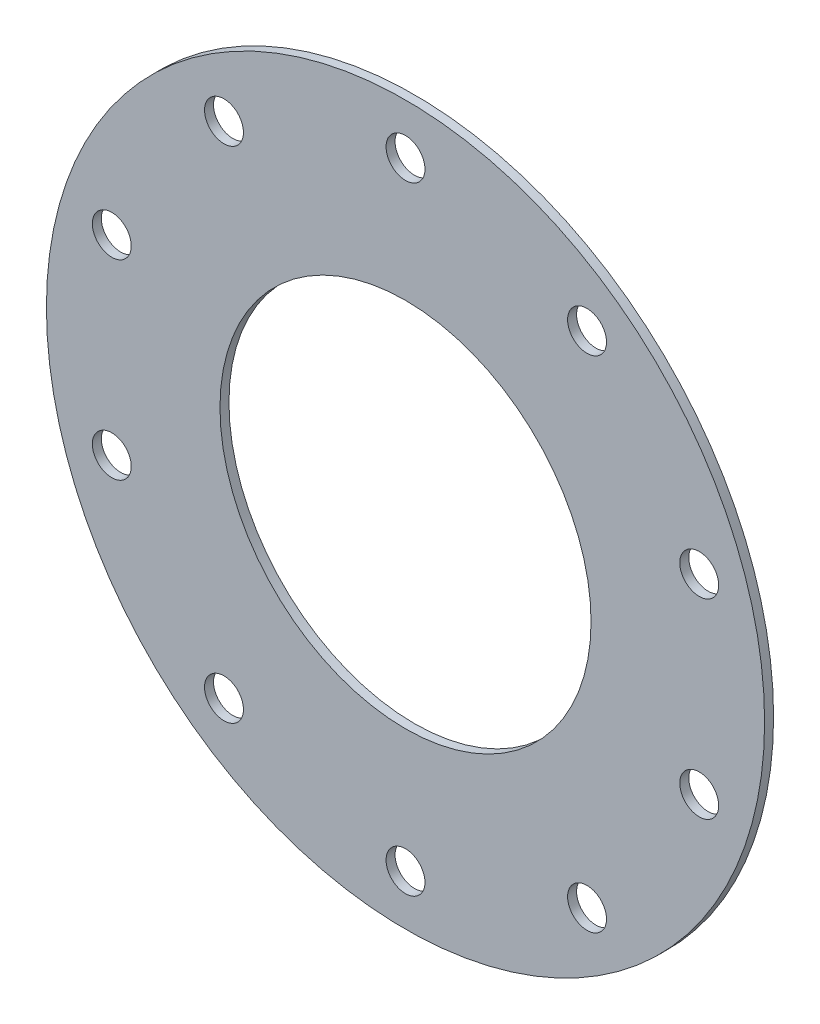
ISO-10303-21;
HEADER;
FILE_DESCRIPTION(('STEP AP214'),'2;1');
FILE_NAME('part.step','',(''),(''),'','','');
FILE_SCHEMA(('AUTOMOTIVE_DESIGN { 1 0 10303 214 1 1 1 1 }'));
ENDSEC;
DATA;
#1=APPLICATION_CONTEXT('core data for automotive mechanical design processes');
#2=APPLICATION_PROTOCOL_DEFINITION('international standard','automotive_design',2000,#1);
#3=PRODUCT_CONTEXT('',#1,'mechanical');
#4=PRODUCT('Part','Part','',(#3));
#5=PRODUCT_RELATED_PRODUCT_CATEGORY('part','',(#4));
#6=PRODUCT_DEFINITION_FORMATION('','',#4);
#7=PRODUCT_DEFINITION_CONTEXT('part definition',#1,'design');
#8=PRODUCT_DEFINITION('design','',#6,#7);
#9=PRODUCT_DEFINITION_SHAPE('','',#8);
#10=(LENGTH_UNIT() NAMED_UNIT(*) SI_UNIT(.MILLI.,.METRE.));
#11=(NAMED_UNIT(*) PLANE_ANGLE_UNIT() SI_UNIT($,.RADIAN.));
#12=(NAMED_UNIT(*) SI_UNIT($,.STERADIAN.) SOLID_ANGLE_UNIT());
#13=UNCERTAINTY_MEASURE_WITH_UNIT(LENGTH_MEASURE(1.E-05),#10,'distance_accuracy_value','');
#14=(GEOMETRIC_REPRESENTATION_CONTEXT(3) GLOBAL_UNCERTAINTY_ASSIGNED_CONTEXT((#13)) GLOBAL_UNIT_ASSIGNED_CONTEXT((#10,
#11,#12)) REPRESENTATION_CONTEXT('',''));
#15=CARTESIAN_POINT('',(0.,0.,0.));
#16=DIRECTION('',(0.,0.,1.));
#17=DIRECTION('',(1.,0.,0.));
#18=AXIS2_PLACEMENT_3D('',#15,#16,#17);
#19=CARTESIAN_POINT('',(0.,0.,1.5));
#20=DIRECTION('',(0.,0.,1.));
#21=DIRECTION('',(1.,0.,0.));
#22=AXIS2_PLACEMENT_3D('',#19,#20,#21);
#23=PLANE('',#22);
#24=CARTESIAN_POINT('',(-49.0745162408275,15.9452769097439,1.5));
#25=DIRECTION('',(0.,0.,1.));
#26=DIRECTION('',(1.,0.,0.));
#27=AXIS2_PLACEMENT_3D('',#24,#25,#26);
#28=CIRCLE('',#27,3.25000000000388);
#29=CARTESIAN_POINT('',(-45.8245162408236,15.9452769097439,1.5));
#30=VERTEX_POINT('',#29);
#31=EDGE_CURVE('E96',#30,#30,#28,.T.);
#32=ORIENTED_EDGE('',*,*,#31,.F.);
#33=EDGE_LOOP('',(#32));
#34=FACE_BOUND('',#33,.T.);
#35=CARTESIAN_POINT('',(-30.3297190182852,-41.7452769097494,1.5));
#36=DIRECTION('',(0.,0.,1.));
#37=DIRECTION('',(1.,0.,0.));
#38=AXIS2_PLACEMENT_3D('',#35,#36,#37);
#39=CIRCLE('',#38,3.25000000000091);
#40=CARTESIAN_POINT('',(-27.0797190182843,-41.7452769097494,1.5));
#41=VERTEX_POINT('',#40);
#42=EDGE_CURVE('E84',#41,#41,#39,.T.);
#43=ORIENTED_EDGE('',*,*,#42,.F.);
#44=EDGE_LOOP('',(#43));
#45=FACE_BOUND('',#44,.T.);
#46=CARTESIAN_POINT('',(30.329719018298,-41.7452769097452,1.5));
#47=DIRECTION('',(0.,0.,1.));
#48=DIRECTION('',(1.,0.,0.));
#49=AXIS2_PLACEMENT_3D('',#46,#47,#48);
#50=CIRCLE('',#49,3.24999999999605);
#51=CARTESIAN_POINT('',(33.579719018294,-41.7452769097452,1.5));
#52=VERTEX_POINT('',#51);
#53=EDGE_CURVE('E72',#52,#52,#50,.T.);
#54=ORIENTED_EDGE('',*,*,#53,.F.);
#55=EDGE_LOOP('',(#54));
#56=FACE_BOUND('',#55,.T.);
#57=CARTESIAN_POINT('',(49.0745162408324,15.9452769097506,1.5));
#58=DIRECTION('',(0.,0.,1.));
#59=DIRECTION('',(1.,0.,0.));
#60=AXIS2_PLACEMENT_3D('',#57,#58,#59);
#61=CIRCLE('',#60,3.24999999999749);
#62=CARTESIAN_POINT('',(52.3245162408298,15.9452769097506,1.5));
#63=VERTEX_POINT('',#62);
#64=EDGE_CURVE('E60',#63,#63,#61,.T.);
#65=ORIENTED_EDGE('',*,*,#64,.F.);
#66=EDGE_LOOP('',(#65));
#67=FACE_BOUND('',#66,.T.);
#68=CARTESIAN_POINT('',(0.,51.6,1.5));
#69=DIRECTION('',(0.,0.,1.));
#70=DIRECTION('',(1.,0.,0.));
#71=AXIS2_PLACEMENT_3D('',#68,#69,#70);
#72=CIRCLE('',#71,3.25);
#73=CARTESIAN_POINT('',(3.25,51.6,1.5));
#74=VERTEX_POINT('',#73);
#75=EDGE_CURVE('E48',#74,#74,#72,.T.);
#76=ORIENTED_EDGE('',*,*,#75,.F.);
#77=EDGE_LOOP('',(#76));
#78=FACE_BOUND('',#77,.T.);
#79=CARTESIAN_POINT('',(0.,0.,1.5));
#80=DIRECTION('',(0.,0.,1.));
#81=DIRECTION('',(1.,0.,0.));
#82=AXIS2_PLACEMENT_3D('',#79,#80,#81);
#83=CIRCLE('',#82,60.);
#84=CARTESIAN_POINT('',(60.,0.,1.5));
#85=VERTEX_POINT('',#84);
#86=EDGE_CURVE('E10',#85,#85,#83,.T.);
#87=ORIENTED_EDGE('',*,*,#86,.T.);
#88=EDGE_LOOP('',(#87));
#89=FACE_BOUND('',#88,.T.);
#90=CARTESIAN_POINT('',(0.,0.,1.5));
#91=DIRECTION('',(0.,0.,1.));
#92=DIRECTION('',(1.,0.,0.));
#93=AXIS2_PLACEMENT_3D('',#90,#91,#92);
#94=CIRCLE('',#93,31.);
#95=CARTESIAN_POINT('',(31.,0.,1.5));
#96=VERTEX_POINT('',#95);
#97=EDGE_CURVE('E43',#96,#96,#94,.T.);
#98=ORIENTED_EDGE('',*,*,#97,.F.);
#99=EDGE_LOOP('',(#98));
#100=FACE_BOUND('',#99,.T.);
#101=CARTESIAN_POINT('',(30.3297190182923,41.7452769097494,1.5));
#102=DIRECTION('',(0.,0.,1.));
#103=DIRECTION('',(1.,0.,0.));
#104=AXIS2_PLACEMENT_3D('',#101,#102,#103);
#105=CIRCLE('',#104,3.2499999999995);
#106=CARTESIAN_POINT('',(33.5797190182918,41.7452769097494,1.5));
#107=VERTEX_POINT('',#106);
#108=EDGE_CURVE('E54',#107,#107,#105,.T.);
#109=ORIENTED_EDGE('',*,*,#108,.F.);
#110=EDGE_LOOP('',(#109));
#111=FACE_BOUND('',#110,.T.);
#112=CARTESIAN_POINT('',(49.0745162408345,-15.9452769097439,1.5));
#113=DIRECTION('',(0.,0.,1.));
#114=DIRECTION('',(1.,0.,0.));
#115=AXIS2_PLACEMENT_3D('',#112,#113,#114);
#116=CIRCLE('',#115,3.24999999999594);
#117=CARTESIAN_POINT('',(52.3245162408305,-15.9452769097439,1.5));
#118=VERTEX_POINT('',#117);
#119=EDGE_CURVE('E66',#118,#118,#116,.T.);
#120=ORIENTED_EDGE('',*,*,#119,.F.);
#121=EDGE_LOOP('',(#120));
#122=FACE_BOUND('',#121,.T.);
#123=CARTESIAN_POINT('',(7.04518263933787E-12,-51.6,1.5));
#124=DIRECTION('',(0.,0.,1.));
#125=DIRECTION('',(1.,0.,0.));
#126=AXIS2_PLACEMENT_3D('',#123,#124,#125);
#127=CIRCLE('',#126,3.2499999999984);
#128=CARTESIAN_POINT('',(3.25000000000545,-51.6,1.5));
#129=VERTEX_POINT('',#128);
#130=EDGE_CURVE('E78',#129,#129,#127,.T.);
#131=ORIENTED_EDGE('',*,*,#130,.F.);
#132=EDGE_LOOP('',(#131));
#133=FACE_BOUND('',#132,.T.);
#134=CARTESIAN_POINT('',(-49.0745162408253,-15.9452769097506,1.5));
#135=DIRECTION('',(0.,0.,1.));
#136=DIRECTION('',(1.,0.,0.));
#137=AXIS2_PLACEMENT_3D('',#134,#135,#136);
#138=CIRCLE('',#137,3.25000000000304);
#139=CARTESIAN_POINT('',(-45.8245162408223,-15.9452769097506,1.5));
#140=VERTEX_POINT('',#139);
#141=EDGE_CURVE('E90',#140,#140,#138,.T.);
#142=ORIENTED_EDGE('',*,*,#141,.F.);
#143=EDGE_LOOP('',(#142));
#144=FACE_BOUND('',#143,.T.);
#145=CARTESIAN_POINT('',(-30.329719018291,41.7452769097452,1.5));
#146=DIRECTION('',(0.,0.,1.));
#147=DIRECTION('',(1.,0.,0.));
#148=AXIS2_PLACEMENT_3D('',#145,#146,#147);
#149=CIRCLE('',#148,3.2500000000019);
#150=CARTESIAN_POINT('',(-27.0797190182891,41.7452769097452,1.5));
#151=VERTEX_POINT('',#150);
#152=EDGE_CURVE('E102',#151,#151,#149,.T.);
#153=ORIENTED_EDGE('',*,*,#152,.F.);
#154=EDGE_LOOP('',(#153));
#155=FACE_BOUND('',#154,.T.);
#156=ADVANCED_FACE('F32',(#34,#45,#56,#67,#78,#89,#100,#111,#122,#133,#144,#155),#23,.T.);
#157=CARTESIAN_POINT('',(0.,0.,0.));
#158=DIRECTION('',(0.,0.,1.));
#159=DIRECTION('',(1.,0.,0.));
#160=AXIS2_PLACEMENT_3D('',#157,#158,#159);
#161=PLANE('',#160);
#162=CARTESIAN_POINT('',(-49.0745162408275,15.9452769097439,0.));
#163=DIRECTION('',(0.,0.,1.));
#164=DIRECTION('',(1.,0.,0.));
#165=AXIS2_PLACEMENT_3D('',#162,#163,#164);
#166=CIRCLE('',#165,3.25000000000388);
#167=CARTESIAN_POINT('',(-45.8245162408236,15.9452769097439,0.));
#168=VERTEX_POINT('',#167);
#169=EDGE_CURVE('E99',#168,#168,#166,.T.);
#170=ORIENTED_EDGE('',*,*,#169,.T.);
#171=EDGE_LOOP('',(#170));
#172=FACE_BOUND('',#171,.T.);
#173=CARTESIAN_POINT('',(-30.3297190182852,-41.7452769097494,0.));
#174=DIRECTION('',(0.,0.,1.));
#175=DIRECTION('',(1.,0.,0.));
#176=AXIS2_PLACEMENT_3D('',#173,#174,#175);
#177=CIRCLE('',#176,3.25000000000091);
#178=CARTESIAN_POINT('',(-27.0797190182843,-41.7452769097494,0.));
#179=VERTEX_POINT('',#178);
#180=EDGE_CURVE('E87',#179,#179,#177,.T.);
#181=ORIENTED_EDGE('',*,*,#180,.T.);
#182=EDGE_LOOP('',(#181));
#183=FACE_BOUND('',#182,.T.);
#184=CARTESIAN_POINT('',(30.329719018298,-41.7452769097452,0.));
#185=DIRECTION('',(0.,0.,1.));
#186=DIRECTION('',(1.,0.,0.));
#187=AXIS2_PLACEMENT_3D('',#184,#185,#186);
#188=CIRCLE('',#187,3.24999999999605);
#189=CARTESIAN_POINT('',(33.579719018294,-41.7452769097452,0.));
#190=VERTEX_POINT('',#189);
#191=EDGE_CURVE('E75',#190,#190,#188,.T.);
#192=ORIENTED_EDGE('',*,*,#191,.T.);
#193=EDGE_LOOP('',(#192));
#194=FACE_BOUND('',#193,.T.);
#195=CARTESIAN_POINT('',(49.0745162408324,15.9452769097506,0.));
#196=DIRECTION('',(0.,0.,1.));
#197=DIRECTION('',(1.,0.,0.));
#198=AXIS2_PLACEMENT_3D('',#195,#196,#197);
#199=CIRCLE('',#198,3.24999999999749);
#200=CARTESIAN_POINT('',(52.3245162408298,15.9452769097506,0.));
#201=VERTEX_POINT('',#200);
#202=EDGE_CURVE('E63',#201,#201,#199,.T.);
#203=ORIENTED_EDGE('',*,*,#202,.T.);
#204=EDGE_LOOP('',(#203));
#205=FACE_BOUND('',#204,.T.);
#206=CARTESIAN_POINT('',(0.,51.6,0.));
#207=DIRECTION('',(0.,0.,1.));
#208=DIRECTION('',(1.,0.,0.));
#209=AXIS2_PLACEMENT_3D('',#206,#207,#208);
#210=CIRCLE('',#209,3.25);
#211=CARTESIAN_POINT('',(3.25,51.6,0.));
#212=VERTEX_POINT('',#211);
#213=EDGE_CURVE('E51',#212,#212,#210,.T.);
#214=ORIENTED_EDGE('',*,*,#213,.T.);
#215=EDGE_LOOP('',(#214));
#216=FACE_BOUND('',#215,.T.);
#217=CARTESIAN_POINT('',(0.,0.,0.));
#218=DIRECTION('',(0.,0.,1.));
#219=DIRECTION('',(1.,0.,0.));
#220=AXIS2_PLACEMENT_3D('',#217,#218,#219);
#221=CIRCLE('',#220,60.);
#222=CARTESIAN_POINT('',(60.,0.,0.));
#223=VERTEX_POINT('',#222);
#224=EDGE_CURVE('E36',#223,#223,#221,.T.);
#225=ORIENTED_EDGE('',*,*,#224,.F.);
#226=EDGE_LOOP('',(#225));
#227=FACE_BOUND('',#226,.T.);
#228=CARTESIAN_POINT('',(0.,0.,0.));
#229=DIRECTION('',(0.,0.,1.));
#230=DIRECTION('',(1.,0.,0.));
#231=AXIS2_PLACEMENT_3D('',#228,#229,#230);
#232=CIRCLE('',#231,31.);
#233=CARTESIAN_POINT('',(31.,0.,0.));
#234=VERTEX_POINT('',#233);
#235=EDGE_CURVE('E45',#234,#234,#232,.T.);
#236=ORIENTED_EDGE('',*,*,#235,.T.);
#237=EDGE_LOOP('',(#236));
#238=FACE_BOUND('',#237,.T.);
#239=CARTESIAN_POINT('',(30.3297190182923,41.7452769097494,0.));
#240=DIRECTION('',(0.,0.,1.));
#241=DIRECTION('',(1.,0.,0.));
#242=AXIS2_PLACEMENT_3D('',#239,#240,#241);
#243=CIRCLE('',#242,3.2499999999995);
#244=CARTESIAN_POINT('',(33.5797190182918,41.7452769097494,0.));
#245=VERTEX_POINT('',#244);
#246=EDGE_CURVE('E57',#245,#245,#243,.T.);
#247=ORIENTED_EDGE('',*,*,#246,.T.);
#248=EDGE_LOOP('',(#247));
#249=FACE_BOUND('',#248,.T.);
#250=CARTESIAN_POINT('',(49.0745162408345,-15.9452769097439,0.));
#251=DIRECTION('',(0.,0.,1.));
#252=DIRECTION('',(1.,0.,0.));
#253=AXIS2_PLACEMENT_3D('',#250,#251,#252);
#254=CIRCLE('',#253,3.24999999999594);
#255=CARTESIAN_POINT('',(52.3245162408305,-15.9452769097439,0.));
#256=VERTEX_POINT('',#255);
#257=EDGE_CURVE('E69',#256,#256,#254,.T.);
#258=ORIENTED_EDGE('',*,*,#257,.T.);
#259=EDGE_LOOP('',(#258));
#260=FACE_BOUND('',#259,.T.);
#261=CARTESIAN_POINT('',(7.04518263933787E-12,-51.6,0.));
#262=DIRECTION('',(0.,0.,1.));
#263=DIRECTION('',(1.,0.,0.));
#264=AXIS2_PLACEMENT_3D('',#261,#262,#263);
#265=CIRCLE('',#264,3.2499999999984);
#266=CARTESIAN_POINT('',(3.25000000000545,-51.6,0.));
#267=VERTEX_POINT('',#266);
#268=EDGE_CURVE('E81',#267,#267,#265,.T.);
#269=ORIENTED_EDGE('',*,*,#268,.T.);
#270=EDGE_LOOP('',(#269));
#271=FACE_BOUND('',#270,.T.);
#272=CARTESIAN_POINT('',(-49.0745162408253,-15.9452769097506,0.));
#273=DIRECTION('',(0.,0.,1.));
#274=DIRECTION('',(1.,0.,0.));
#275=AXIS2_PLACEMENT_3D('',#272,#273,#274);
#276=CIRCLE('',#275,3.25000000000304);
#277=CARTESIAN_POINT('',(-45.8245162408223,-15.9452769097506,0.));
#278=VERTEX_POINT('',#277);
#279=EDGE_CURVE('E93',#278,#278,#276,.T.);
#280=ORIENTED_EDGE('',*,*,#279,.T.);
#281=EDGE_LOOP('',(#280));
#282=FACE_BOUND('',#281,.T.);
#283=CARTESIAN_POINT('',(-30.329719018291,41.7452769097452,0.));
#284=DIRECTION('',(0.,0.,1.));
#285=DIRECTION('',(1.,0.,0.));
#286=AXIS2_PLACEMENT_3D('',#283,#284,#285);
#287=CIRCLE('',#286,3.2500000000019);
#288=CARTESIAN_POINT('',(-27.0797190182891,41.7452769097452,0.));
#289=VERTEX_POINT('',#288);
#290=EDGE_CURVE('E105',#289,#289,#287,.T.);
#291=ORIENTED_EDGE('',*,*,#290,.T.);
#292=EDGE_LOOP('',(#291));
#293=FACE_BOUND('',#292,.T.);
#294=ADVANCED_FACE('F115',(#172,#183,#194,#205,#216,#227,#238,#249,#260,#271,#282,#293),#161,.F.);
#295=CARTESIAN_POINT('',(0.,0.,1.5));
#296=DIRECTION('',(0.,0.,-1.));
#297=DIRECTION('',(-1.,0.,0.));
#298=AXIS2_PLACEMENT_3D('',#295,#296,#297);
#299=CYLINDRICAL_SURFACE('',#298,60.);
#300=ORIENTED_EDGE('',*,*,#86,.F.);
#301=EDGE_LOOP('',(#300));
#302=FACE_BOUND('',#301,.T.);
#303=ORIENTED_EDGE('',*,*,#224,.T.);
#304=EDGE_LOOP('',(#303));
#305=FACE_BOUND('',#304,.T.);
#306=ADVANCED_FACE('F34',(#302,#305),#299,.T.);
#307=CARTESIAN_POINT('',(0.,0.,1.5));
#308=DIRECTION('',(0.,0.,-1.));
#309=DIRECTION('',(-1.,0.,0.));
#310=AXIS2_PLACEMENT_3D('',#307,#308,#309);
#311=CYLINDRICAL_SURFACE('',#310,31.);
#312=ORIENTED_EDGE('',*,*,#97,.T.);
#313=EDGE_LOOP('',(#312));
#314=FACE_BOUND('',#313,.T.);
#315=ORIENTED_EDGE('',*,*,#235,.F.);
#316=EDGE_LOOP('',(#315));
#317=FACE_BOUND('',#316,.T.);
#318=ADVANCED_FACE('F125',(#314,#317),#311,.F.);
#319=CARTESIAN_POINT('',(0.,51.6,1.5));
#320=DIRECTION('',(0.,0.,-1.));
#321=DIRECTION('',(-1.,0.,0.));
#322=AXIS2_PLACEMENT_3D('',#319,#320,#321);
#323=CYLINDRICAL_SURFACE('',#322,3.25);
#324=ORIENTED_EDGE('',*,*,#75,.T.);
#325=EDGE_LOOP('',(#324));
#326=FACE_BOUND('',#325,.T.);
#327=ORIENTED_EDGE('',*,*,#213,.F.);
#328=EDGE_LOOP('',(#327));
#329=FACE_BOUND('',#328,.T.);
#330=ADVANCED_FACE('F128',(#326,#329),#323,.F.);
#331=CARTESIAN_POINT('',(30.3297190182923,41.7452769097494,1.5));
#332=DIRECTION('',(0.,0.,-1.));
#333=DIRECTION('',(-1.,0.,0.));
#334=AXIS2_PLACEMENT_3D('',#331,#332,#333);
#335=CYLINDRICAL_SURFACE('',#334,3.2499999999995);
#336=ORIENTED_EDGE('',*,*,#108,.T.);
#337=EDGE_LOOP('',(#336));
#338=FACE_BOUND('',#337,.T.);
#339=ORIENTED_EDGE('',*,*,#246,.F.);
#340=EDGE_LOOP('',(#339));
#341=FACE_BOUND('',#340,.T.);
#342=ADVANCED_FACE('F132',(#338,#341),#335,.F.);
#343=CARTESIAN_POINT('',(49.0745162408324,15.9452769097506,1.5));
#344=DIRECTION('',(0.,0.,-1.));
#345=DIRECTION('',(-1.,0.,0.));
#346=AXIS2_PLACEMENT_3D('',#343,#344,#345);
#347=CYLINDRICAL_SURFACE('',#346,3.24999999999749);
#348=ORIENTED_EDGE('',*,*,#64,.T.);
#349=EDGE_LOOP('',(#348));
#350=FACE_BOUND('',#349,.T.);
#351=ORIENTED_EDGE('',*,*,#202,.F.);
#352=EDGE_LOOP('',(#351));
#353=FACE_BOUND('',#352,.T.);
#354=ADVANCED_FACE('F136',(#350,#353),#347,.F.);
#355=CARTESIAN_POINT('',(49.0745162408345,-15.9452769097439,1.5));
#356=DIRECTION('',(0.,0.,-1.));
#357=DIRECTION('',(-1.,0.,0.));
#358=AXIS2_PLACEMENT_3D('',#355,#356,#357);
#359=CYLINDRICAL_SURFACE('',#358,3.24999999999594);
#360=ORIENTED_EDGE('',*,*,#119,.T.);
#361=EDGE_LOOP('',(#360));
#362=FACE_BOUND('',#361,.T.);
#363=ORIENTED_EDGE('',*,*,#257,.F.);
#364=EDGE_LOOP('',(#363));
#365=FACE_BOUND('',#364,.T.);
#366=ADVANCED_FACE('F140',(#362,#365),#359,.F.);
#367=CARTESIAN_POINT('',(30.329719018298,-41.7452769097452,1.5));
#368=DIRECTION('',(0.,0.,-1.));
#369=DIRECTION('',(-1.,0.,0.));
#370=AXIS2_PLACEMENT_3D('',#367,#368,#369);
#371=CYLINDRICAL_SURFACE('',#370,3.24999999999605);
#372=ORIENTED_EDGE('',*,*,#53,.T.);
#373=EDGE_LOOP('',(#372));
#374=FACE_BOUND('',#373,.T.);
#375=ORIENTED_EDGE('',*,*,#191,.F.);
#376=EDGE_LOOP('',(#375));
#377=FACE_BOUND('',#376,.T.);
#378=ADVANCED_FACE('F144',(#374,#377),#371,.F.);
#379=CARTESIAN_POINT('',(7.04518263933787E-12,-51.6,1.5));
#380=DIRECTION('',(0.,0.,-1.));
#381=DIRECTION('',(-1.,0.,0.));
#382=AXIS2_PLACEMENT_3D('',#379,#380,#381);
#383=CYLINDRICAL_SURFACE('',#382,3.2499999999984);
#384=ORIENTED_EDGE('',*,*,#130,.T.);
#385=EDGE_LOOP('',(#384));
#386=FACE_BOUND('',#385,.T.);
#387=ORIENTED_EDGE('',*,*,#268,.F.);
#388=EDGE_LOOP('',(#387));
#389=FACE_BOUND('',#388,.T.);
#390=ADVANCED_FACE('F148',(#386,#389),#383,.F.);
#391=CARTESIAN_POINT('',(-30.3297190182852,-41.7452769097494,1.5));
#392=DIRECTION('',(0.,0.,-1.));
#393=DIRECTION('',(-1.,0.,0.));
#394=AXIS2_PLACEMENT_3D('',#391,#392,#393);
#395=CYLINDRICAL_SURFACE('',#394,3.25000000000091);
#396=ORIENTED_EDGE('',*,*,#42,.T.);
#397=EDGE_LOOP('',(#396));
#398=FACE_BOUND('',#397,.T.);
#399=ORIENTED_EDGE('',*,*,#180,.F.);
#400=EDGE_LOOP('',(#399));
#401=FACE_BOUND('',#400,.T.);
#402=ADVANCED_FACE('F152',(#398,#401),#395,.F.);
#403=CARTESIAN_POINT('',(-49.0745162408253,-15.9452769097506,1.5));
#404=DIRECTION('',(0.,0.,-1.));
#405=DIRECTION('',(-1.,0.,0.));
#406=AXIS2_PLACEMENT_3D('',#403,#404,#405);
#407=CYLINDRICAL_SURFACE('',#406,3.25000000000304);
#408=ORIENTED_EDGE('',*,*,#141,.T.);
#409=EDGE_LOOP('',(#408));
#410=FACE_BOUND('',#409,.T.);
#411=ORIENTED_EDGE('',*,*,#279,.F.);
#412=EDGE_LOOP('',(#411));
#413=FACE_BOUND('',#412,.T.);
#414=ADVANCED_FACE('F156',(#410,#413),#407,.F.);
#415=CARTESIAN_POINT('',(-49.0745162408275,15.9452769097439,1.5));
#416=DIRECTION('',(0.,0.,-1.));
#417=DIRECTION('',(-1.,0.,0.));
#418=AXIS2_PLACEMENT_3D('',#415,#416,#417);
#419=CYLINDRICAL_SURFACE('',#418,3.25000000000388);
#420=ORIENTED_EDGE('',*,*,#31,.T.);
#421=EDGE_LOOP('',(#420));
#422=FACE_BOUND('',#421,.T.);
#423=ORIENTED_EDGE('',*,*,#169,.F.);
#424=EDGE_LOOP('',(#423));
#425=FACE_BOUND('',#424,.T.);
#426=ADVANCED_FACE('F160',(#422,#425),#419,.F.);
#427=CARTESIAN_POINT('',(-30.329719018291,41.7452769097452,1.5));
#428=DIRECTION('',(0.,0.,-1.));
#429=DIRECTION('',(-1.,0.,0.));
#430=AXIS2_PLACEMENT_3D('',#427,#428,#429);
#431=CYLINDRICAL_SURFACE('',#430,3.2500000000019);
#432=ORIENTED_EDGE('',*,*,#152,.T.);
#433=EDGE_LOOP('',(#432));
#434=FACE_BOUND('',#433,.T.);
#435=ORIENTED_EDGE('',*,*,#290,.F.);
#436=EDGE_LOOP('',(#435));
#437=FACE_BOUND('',#436,.T.);
#438=ADVANCED_FACE('F111',(#434,#437),#431,.F.);
#439=CLOSED_SHELL('',(#156,#294,#306,#318,#330,#342,#354,#366,#378,#390,#402,#414,#426,#438));
#440=MANIFOLD_SOLID_BREP('B2',#439);
#441=ADVANCED_BREP_SHAPE_REPRESENTATION('',(#18,#440),#14);
#442=SHAPE_DEFINITION_REPRESENTATION(#9,#441);
ENDSEC;
END-ISO-10303-21;
